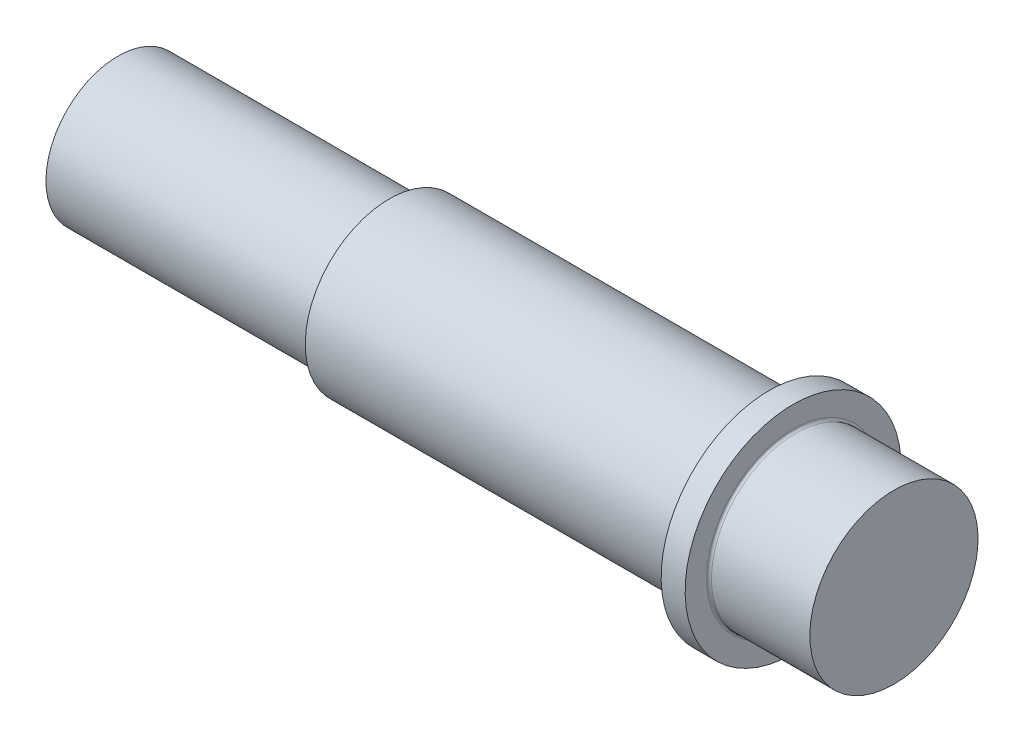
ISO-10303-21;
HEADER;
FILE_DESCRIPTION(('STEP AP214'),'2;1');
FILE_NAME('part.step','',(''),(''),'','','');
FILE_SCHEMA(('AUTOMOTIVE_DESIGN { 1 0 10303 214 1 1 1 1 }'));
ENDSEC;
DATA;
#1=APPLICATION_CONTEXT('core data for automotive mechanical design processes');
#2=APPLICATION_PROTOCOL_DEFINITION('international standard','automotive_design',2000,#1);
#3=PRODUCT_CONTEXT('',#1,'mechanical');
#4=PRODUCT('Part','Part','',(#3));
#5=PRODUCT_RELATED_PRODUCT_CATEGORY('part','',(#4));
#6=PRODUCT_DEFINITION_FORMATION('','',#4);
#7=PRODUCT_DEFINITION_CONTEXT('part definition',#1,'design');
#8=PRODUCT_DEFINITION('design','',#6,#7);
#9=PRODUCT_DEFINITION_SHAPE('','',#8);
#10=(LENGTH_UNIT() NAMED_UNIT(*) SI_UNIT(.MILLI.,.METRE.));
#11=(NAMED_UNIT(*) PLANE_ANGLE_UNIT() SI_UNIT($,.RADIAN.));
#12=(NAMED_UNIT(*) SI_UNIT($,.STERADIAN.) SOLID_ANGLE_UNIT());
#13=UNCERTAINTY_MEASURE_WITH_UNIT(LENGTH_MEASURE(1.E-05),#10,'distance_accuracy_value','');
#14=(GEOMETRIC_REPRESENTATION_CONTEXT(3) GLOBAL_UNCERTAINTY_ASSIGNED_CONTEXT((#13)) GLOBAL_UNIT_ASSIGNED_CONTEXT((#10,
#11,#12)) REPRESENTATION_CONTEXT('',''));
#15=CARTESIAN_POINT('',(0.,0.,0.));
#16=DIRECTION('',(0.,0.,1.));
#17=DIRECTION('',(1.,0.,0.));
#18=AXIS2_PLACEMENT_3D('',#15,#16,#17);
#19=CARTESIAN_POINT('',(-80.816688045695,15.015,0.));
#20=DIRECTION('',(1.,0.,0.));
#21=DIRECTION('',(0.,1.,0.));
#22=AXIS2_PLACEMENT_3D('',#19,#20,#21);
#23=PLANE('',#22);
#24=CARTESIAN_POINT('',(-80.816688045695,0.,0.));
#25=DIRECTION('',(-1.,0.,0.));
#26=DIRECTION('',(0.,-1.,0.));
#27=AXIS2_PLACEMENT_3D('',#24,#25,#26);
#28=CIRCLE('',#27,15.015);
#29=CARTESIAN_POINT('',(-80.816688045695,-15.015,0.));
#30=VERTEX_POINT('',#29);
#31=EDGE_CURVE('E75',#30,#30,#28,.T.);
#32=ORIENTED_EDGE('',*,*,#31,.T.);
#33=EDGE_LOOP('',(#32));
#34=FACE_BOUND('',#33,.T.);
#35=ADVANCED_FACE('F37',(#34),#23,.F.);
#36=CARTESIAN_POINT('',(80.816688045695,17.5175,0.));
#37=DIRECTION('',(-1.,0.,0.));
#38=DIRECTION('',(0.,-1.,0.));
#39=AXIS2_PLACEMENT_3D('',#36,#37,#38);
#40=PLANE('',#39);
#41=CARTESIAN_POINT('',(80.816688045695,0.,0.));
#42=DIRECTION('',(-1.,0.,0.));
#43=DIRECTION('',(0.,-1.,0.));
#44=AXIS2_PLACEMENT_3D('',#41,#42,#43);
#45=CIRCLE('',#44,17.5175);
#46=CARTESIAN_POINT('',(80.816688045695,-17.5174999999999,0.));
#47=VERTEX_POINT('',#46);
#48=EDGE_CURVE('E63',#47,#47,#45,.T.);
#49=ORIENTED_EDGE('',*,*,#48,.F.);
#50=EDGE_LOOP('',(#49));
#51=FACE_BOUND('',#50,.T.);
#52=ADVANCED_FACE('F97',(#51),#40,.F.);
#53=CARTESIAN_POINT('',(-91.4543498076178,0.,0.));
#54=DIRECTION('',(-1.,0.,0.));
#55=DIRECTION('',(0.,-1.,0.));
#56=AXIS2_PLACEMENT_3D('',#53,#54,#55);
#57=CYLINDRICAL_SURFACE('',#56,17.5175);
#58=CARTESIAN_POINT('',(60.316688045695,0.,0.));
#59=DIRECTION('',(-1.,0.,0.));
#60=DIRECTION('',(0.,-1.,0.));
#61=AXIS2_PLACEMENT_3D('',#58,#59,#60);
#62=CIRCLE('',#61,17.5175);
#63=CARTESIAN_POINT('',(60.316688045695,-17.5174999999999,0.));
#64=VERTEX_POINT('',#63);
#65=EDGE_CURVE('E48',#64,#64,#62,.F.);
#66=ORIENTED_EDGE('',*,*,#65,.T.);
#67=EDGE_LOOP('',(#66));
#68=FACE_BOUND('',#67,.T.);
#69=ORIENTED_EDGE('',*,*,#48,.T.);
#70=EDGE_LOOP('',(#69));
#71=FACE_BOUND('',#70,.T.);
#72=ADVANCED_FACE('F102',(#68,#71),#57,.T.);
#73=CARTESIAN_POINT('',(59.816688045695,22.5,0.));
#74=DIRECTION('',(-1.,0.,0.));
#75=DIRECTION('',(0.,-1.,0.));
#76=AXIS2_PLACEMENT_3D('',#73,#74,#75);
#77=PLANE('',#76);
#78=CARTESIAN_POINT('',(59.816688045695,0.,0.));
#79=DIRECTION('',(-1.,0.,0.));
#80=DIRECTION('',(0.,-1.,0.));
#81=AXIS2_PLACEMENT_3D('',#78,#79,#80);
#82=CIRCLE('',#81,18.0175);
#83=CARTESIAN_POINT('',(59.816688045695,-18.0174999999999,0.));
#84=VERTEX_POINT('',#83);
#85=EDGE_CURVE('E52',#84,#84,#82,.T.);
#86=ORIENTED_EDGE('',*,*,#85,.T.);
#87=EDGE_LOOP('',(#86));
#88=FACE_BOUND('',#87,.T.);
#89=CARTESIAN_POINT('',(59.816688045695,0.,0.));
#90=DIRECTION('',(-1.,0.,0.));
#91=DIRECTION('',(0.,-1.,0.));
#92=AXIS2_PLACEMENT_3D('',#89,#90,#91);
#93=CIRCLE('',#92,22.5);
#94=CARTESIAN_POINT('',(59.816688045695,-22.4999999999999,0.));
#95=VERTEX_POINT('',#94);
#96=EDGE_CURVE('E66',#95,#95,#93,.T.);
#97=ORIENTED_EDGE('',*,*,#96,.F.);
#98=EDGE_LOOP('',(#97));
#99=FACE_BOUND('',#98,.T.);
#100=ADVANCED_FACE('F116',(#88,#99),#77,.F.);
#101=CARTESIAN_POINT('',(-91.4543498076178,0.,0.));
#102=DIRECTION('',(-1.,0.,0.));
#103=DIRECTION('',(0.,-1.,0.));
#104=AXIS2_PLACEMENT_3D('',#101,#102,#103);
#105=CYLINDRICAL_SURFACE('',#104,22.5);
#106=CARTESIAN_POINT('',(54.816688045695,0.,0.));
#107=DIRECTION('',(-1.,0.,0.));
#108=DIRECTION('',(0.,-1.,0.));
#109=AXIS2_PLACEMENT_3D('',#106,#107,#108);
#110=CIRCLE('',#109,22.5);
#111=CARTESIAN_POINT('',(54.816688045695,-22.4999999999999,0.));
#112=VERTEX_POINT('',#111);
#113=EDGE_CURVE('E69',#112,#112,#110,.T.);
#114=ORIENTED_EDGE('',*,*,#113,.F.);
#115=EDGE_LOOP('',(#114));
#116=FACE_BOUND('',#115,.T.);
#117=ORIENTED_EDGE('',*,*,#96,.T.);
#118=EDGE_LOOP('',(#117));
#119=FACE_BOUND('',#118,.T.);
#120=ADVANCED_FACE('F119',(#116,#119),#105,.T.);
#121=CARTESIAN_POINT('',(54.816688045695,17.5,0.));
#122=DIRECTION('',(1.,0.,0.));
#123=DIRECTION('',(0.,1.,0.));
#124=AXIS2_PLACEMENT_3D('',#121,#122,#123);
#125=PLANE('',#124);
#126=CARTESIAN_POINT('',(54.816688045695,0.,0.));
#127=DIRECTION('',(1.,0.,0.));
#128=DIRECTION('',(0.,1.,0.));
#129=AXIS2_PLACEMENT_3D('',#126,#127,#128);
#130=CIRCLE('',#129,18.);
#131=CARTESIAN_POINT('',(54.816688045695,18.,0.));
#132=VERTEX_POINT('',#131);
#133=EDGE_CURVE('E10',#132,#132,#130,.T.);
#134=ORIENTED_EDGE('',*,*,#133,.T.);
#135=EDGE_LOOP('',(#134));
#136=FACE_BOUND('',#135,.T.);
#137=ORIENTED_EDGE('',*,*,#113,.T.);
#138=EDGE_LOOP('',(#137));
#139=FACE_BOUND('',#138,.T.);
#140=ADVANCED_FACE('F124',(#136,#139),#125,.F.);
#141=CARTESIAN_POINT('',(-91.4543498076178,0.,0.));
#142=DIRECTION('',(-1.,0.,0.));
#143=DIRECTION('',(0.,-1.,0.));
#144=AXIS2_PLACEMENT_3D('',#141,#142,#143);
#145=CYLINDRICAL_SURFACE('',#144,17.5);
#146=CARTESIAN_POINT('',(54.316688045695,0.,0.));
#147=DIRECTION('',(1.,0.,0.));
#148=DIRECTION('',(0.,1.,0.));
#149=AXIS2_PLACEMENT_3D('',#146,#147,#148);
#150=CIRCLE('',#149,17.5);
#151=CARTESIAN_POINT('',(54.316688045695,17.5,0.));
#152=VERTEX_POINT('',#151);
#153=EDGE_CURVE('E44',#152,#152,#150,.F.);
#154=ORIENTED_EDGE('',*,*,#153,.T.);
#155=EDGE_LOOP('',(#154));
#156=FACE_BOUND('',#155,.T.);
#157=CARTESIAN_POINT('',(-24.316688045695,0.,0.));
#158=DIRECTION('',(-1.,0.,0.));
#159=DIRECTION('',(0.,-1.,0.));
#160=AXIS2_PLACEMENT_3D('',#157,#158,#159);
#161=CIRCLE('',#160,17.5);
#162=CARTESIAN_POINT('',(-24.316688045695,-17.5,0.));
#163=VERTEX_POINT('',#162);
#164=EDGE_CURVE('E72',#163,#163,#161,.T.);
#165=ORIENTED_EDGE('',*,*,#164,.F.);
#166=EDGE_LOOP('',(#165));
#167=FACE_BOUND('',#166,.T.);
#168=ADVANCED_FACE('F93',(#156,#167),#145,.T.);
#169=CARTESIAN_POINT('',(-24.316688045695,15.015,0.));
#170=DIRECTION('',(1.,0.,0.));
#171=DIRECTION('',(0.,1.,0.));
#172=AXIS2_PLACEMENT_3D('',#169,#170,#171);
#173=PLANE('',#172);
#174=CARTESIAN_POINT('',(-24.316688045695,0.,0.));
#175=DIRECTION('',(1.,0.,0.));
#176=DIRECTION('',(0.,1.,0.));
#177=AXIS2_PLACEMENT_3D('',#174,#175,#176);
#178=CIRCLE('',#177,15.515);
#179=CARTESIAN_POINT('',(-24.316688045695,15.515,0.));
#180=VERTEX_POINT('',#179);
#181=EDGE_CURVE('E57',#180,#180,#178,.T.);
#182=ORIENTED_EDGE('',*,*,#181,.T.);
#183=EDGE_LOOP('',(#182));
#184=FACE_BOUND('',#183,.T.);
#185=ORIENTED_EDGE('',*,*,#164,.T.);
#186=EDGE_LOOP('',(#185));
#187=FACE_BOUND('',#186,.T.);
#188=ADVANCED_FACE('F83',(#184,#187),#173,.F.);
#189=CARTESIAN_POINT('',(-91.4543498076178,0.,0.));
#190=DIRECTION('',(-1.,0.,0.));
#191=DIRECTION('',(0.,-1.,0.));
#192=AXIS2_PLACEMENT_3D('',#189,#190,#191);
#193=CYLINDRICAL_SURFACE('',#192,15.015);
#194=CARTESIAN_POINT('',(-24.816688045695,0.,0.));
#195=DIRECTION('',(1.,0.,0.));
#196=DIRECTION('',(0.,1.,0.));
#197=AXIS2_PLACEMENT_3D('',#194,#195,#196);
#198=CIRCLE('',#197,15.015);
#199=CARTESIAN_POINT('',(-24.816688045695,15.015,0.));
#200=VERTEX_POINT('',#199);
#201=EDGE_CURVE('E60',#200,#200,#198,.F.);
#202=ORIENTED_EDGE('',*,*,#201,.T.);
#203=EDGE_LOOP('',(#202));
#204=FACE_BOUND('',#203,.T.);
#205=ORIENTED_EDGE('',*,*,#31,.F.);
#206=EDGE_LOOP('',(#205));
#207=FACE_BOUND('',#206,.T.);
#208=ADVANCED_FACE('F80',(#204,#207),#193,.T.);
#209=CARTESIAN_POINT('',(-24.816688045695,0.,0.));
#210=DIRECTION('',(1.,0.,0.));
#211=DIRECTION('',(0.,1.,0.));
#212=AXIS2_PLACEMENT_3D('',#209,#210,#211);
#213=TOROIDAL_SURFACE('',#212,15.515,0.5);
#214=ORIENTED_EDGE('',*,*,#181,.F.);
#215=EDGE_LOOP('',(#214));
#216=FACE_BOUND('',#215,.T.);
#217=ORIENTED_EDGE('',*,*,#201,.F.);
#218=EDGE_LOOP('',(#217));
#219=FACE_BOUND('',#218,.T.);
#220=ADVANCED_FACE('F82',(#216,#219),#213,.F.);
#221=CARTESIAN_POINT('',(60.316688045695,0.,0.));
#222=DIRECTION('',(-1.,0.,0.));
#223=DIRECTION('',(0.,-1.,0.));
#224=AXIS2_PLACEMENT_3D('',#221,#222,#223);
#225=TOROIDAL_SURFACE('',#224,18.0175,0.5);
#226=ORIENTED_EDGE('',*,*,#65,.F.);
#227=EDGE_LOOP('',(#226));
#228=FACE_BOUND('',#227,.T.);
#229=ORIENTED_EDGE('',*,*,#85,.F.);
#230=EDGE_LOOP('',(#229));
#231=FACE_BOUND('',#230,.T.);
#232=ADVANCED_FACE('F90',(#228,#231),#225,.F.);
#233=CARTESIAN_POINT('',(54.316688045695,0.,0.));
#234=DIRECTION('',(1.,0.,0.));
#235=DIRECTION('',(0.,1.,0.));
#236=AXIS2_PLACEMENT_3D('',#233,#234,#235);
#237=TOROIDAL_SURFACE('',#236,18.,0.5);
#238=ORIENTED_EDGE('',*,*,#133,.F.);
#239=EDGE_LOOP('',(#238));
#240=FACE_BOUND('',#239,.T.);
#241=ORIENTED_EDGE('',*,*,#153,.F.);
#242=EDGE_LOOP('',(#241));
#243=FACE_BOUND('',#242,.T.);
#244=ADVANCED_FACE('F39',(#240,#243),#237,.F.);
#245=CLOSED_SHELL('',(#35,#52,#72,#100,#120,#140,#168,#188,#208,#220,#232,#244));
#246=MANIFOLD_SOLID_BREP('B2',#245);
#247=ADVANCED_BREP_SHAPE_REPRESENTATION('',(#18,#246),#14);
#248=SHAPE_DEFINITION_REPRESENTATION(#9,#247);
ENDSEC;
END-ISO-10303-21;
